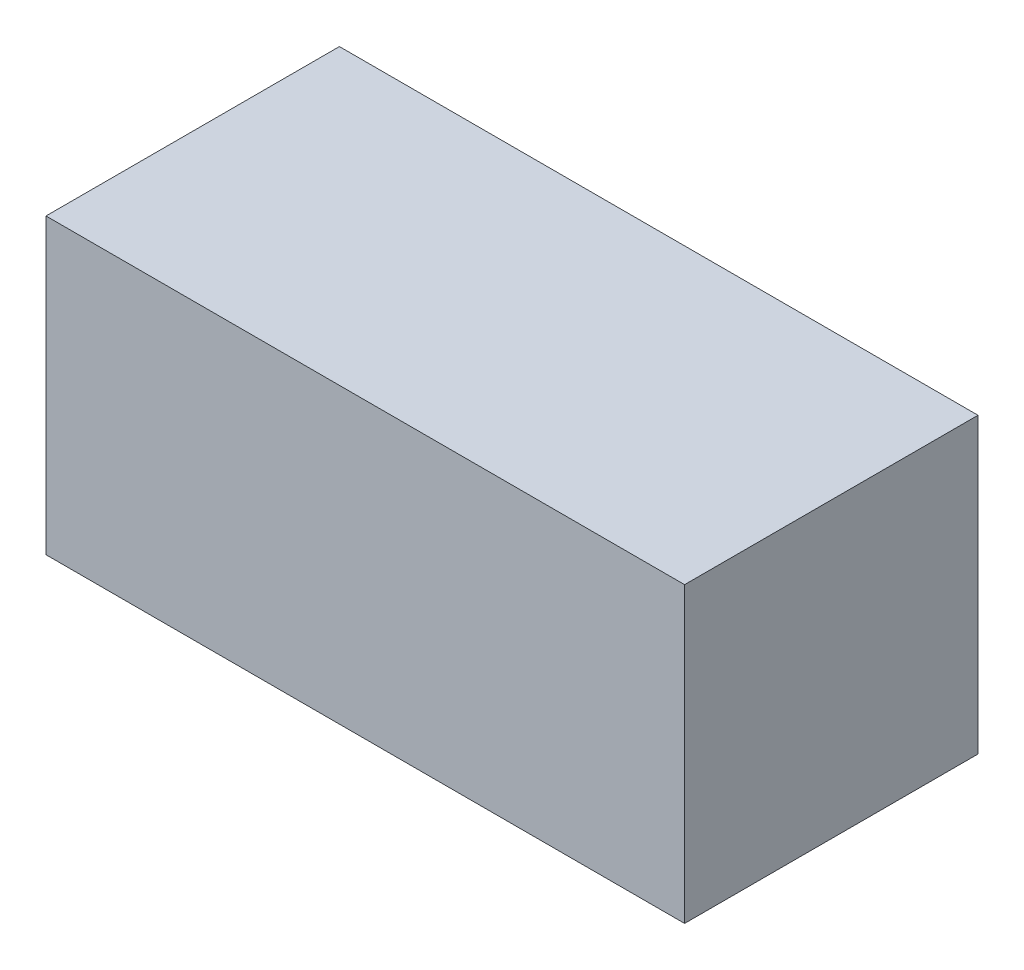
ISO-10303-21;
HEADER;
FILE_DESCRIPTION(('STEP AP214'),'2;1');
FILE_NAME('part.step','',(''),(''),'','','');
FILE_SCHEMA(('AUTOMOTIVE_DESIGN { 1 0 10303 214 1 1 1 1 }'));
ENDSEC;
DATA;
#1=APPLICATION_CONTEXT('core data for automotive mechanical design processes');
#2=APPLICATION_PROTOCOL_DEFINITION('international standard','automotive_design',2000,#1);
#3=PRODUCT_CONTEXT('',#1,'mechanical');
#4=PRODUCT('Part','Part','',(#3));
#5=PRODUCT_RELATED_PRODUCT_CATEGORY('part','',(#4));
#6=PRODUCT_DEFINITION_FORMATION('','',#4);
#7=PRODUCT_DEFINITION_CONTEXT('part definition',#1,'design');
#8=PRODUCT_DEFINITION('design','',#6,#7);
#9=PRODUCT_DEFINITION_SHAPE('','',#8);
#10=(LENGTH_UNIT() NAMED_UNIT(*) SI_UNIT(.MILLI.,.METRE.));
#11=(NAMED_UNIT(*) PLANE_ANGLE_UNIT() SI_UNIT($,.RADIAN.));
#12=(NAMED_UNIT(*) SI_UNIT($,.STERADIAN.) SOLID_ANGLE_UNIT());
#13=UNCERTAINTY_MEASURE_WITH_UNIT(LENGTH_MEASURE(1.E-05),#10,'distance_accuracy_value','');
#14=(GEOMETRIC_REPRESENTATION_CONTEXT(3) GLOBAL_UNCERTAINTY_ASSIGNED_CONTEXT((#13)) GLOBAL_UNIT_ASSIGNED_CONTEXT((#10,
#11,#12)) REPRESENTATION_CONTEXT('',''));
#15=CARTESIAN_POINT('',(0.,0.,0.));
#16=DIRECTION('',(0.,0.,1.));
#17=DIRECTION('',(1.,0.,0.));
#18=AXIS2_PLACEMENT_3D('',#15,#16,#17);
#19=CARTESIAN_POINT('',(1.850009,0.850010999999998,1.6999966));
#20=DIRECTION('',(-1.,0.,0.));
#21=DIRECTION('',(0.,0.,1.));
#22=AXIS2_PLACEMENT_3D('',#19,#20,#21);
#23=PLANE('',#22);
#24=DIRECTION('',(0.,1.,0.));
#25=VECTOR('',#24,1.);
#26=CARTESIAN_POINT('',(1.850009,0.850010999999998,0.));
#27=LINE('',#26,#25);
#28=CARTESIAN_POINT('',(1.850009,-0.850010999999998,0.));
#29=VERTEX_POINT('',#28);
#30=CARTESIAN_POINT('',(1.850009,0.850010999999998,0.));
#31=VERTEX_POINT('',#30);
#32=EDGE_CURVE('E95',#29,#31,#27,.T.);
#33=ORIENTED_EDGE('',*,*,#32,.T.);
#34=DIRECTION('',(0.,0.,-1.));
#35=VECTOR('',#34,1.);
#36=CARTESIAN_POINT('',(1.850009,0.850010999999998,1.6999966));
#37=LINE('',#36,#35);
#38=CARTESIAN_POINT('',(1.850009,0.850010999999998,1.6999966));
#39=VERTEX_POINT('',#38);
#40=EDGE_CURVE('E11',#39,#31,#37,.T.);
#41=ORIENTED_EDGE('',*,*,#40,.F.);
#42=DIRECTION('',(0.,1.,0.));
#43=VECTOR('',#42,1.);
#44=CARTESIAN_POINT('',(1.850009,0.850010999999998,1.6999966));
#45=LINE('',#44,#43);
#46=CARTESIAN_POINT('',(1.850009,-0.850010999999998,1.6999966));
#47=VERTEX_POINT('',#46);
#48=EDGE_CURVE('E83',#47,#39,#45,.T.);
#49=ORIENTED_EDGE('',*,*,#48,.F.);
#50=DIRECTION('',(0.,0.,-1.));
#51=VECTOR('',#50,1.);
#52=CARTESIAN_POINT('',(1.850009,-0.850010999999998,1.6999966));
#53=LINE('',#52,#51);
#54=EDGE_CURVE('E91',#47,#29,#53,.T.);
#55=ORIENTED_EDGE('',*,*,#54,.T.);
#56=EDGE_LOOP('',(#33,#41,#49,#55));
#57=FACE_BOUND('',#56,.T.);
#58=ADVANCED_FACE('F32',(#57),#23,.F.);
#59=CARTESIAN_POINT('',(-1.850009,0.850010999999998,1.6999966));
#60=DIRECTION('',(0.,-1.,0.));
#61=DIRECTION('',(0.,0.,-1.));
#62=AXIS2_PLACEMENT_3D('',#59,#60,#61);
#63=PLANE('',#62);
#64=DIRECTION('',(-1.,0.,0.));
#65=VECTOR('',#64,1.);
#66=CARTESIAN_POINT('',(-1.850009,0.850010999999998,0.));
#67=LINE('',#66,#65);
#68=CARTESIAN_POINT('',(-1.850009,0.850010999999998,0.));
#69=VERTEX_POINT('',#68);
#70=EDGE_CURVE('E87',#31,#69,#67,.T.);
#71=ORIENTED_EDGE('',*,*,#70,.T.);
#72=DIRECTION('',(0.,0.,-1.));
#73=VECTOR('',#72,1.);
#74=CARTESIAN_POINT('',(-1.850009,0.850010999999998,1.6999966));
#75=LINE('',#74,#73);
#76=CARTESIAN_POINT('',(-1.850009,0.850010999999998,1.6999966));
#77=VERTEX_POINT('',#76);
#78=EDGE_CURVE('E40',#77,#69,#75,.T.);
#79=ORIENTED_EDGE('',*,*,#78,.F.);
#80=DIRECTION('',(-1.,0.,0.));
#81=VECTOR('',#80,1.);
#82=CARTESIAN_POINT('',(-1.850009,0.850010999999998,1.6999966));
#83=LINE('',#82,#81);
#84=EDGE_CURVE('E78',#39,#77,#83,.T.);
#85=ORIENTED_EDGE('',*,*,#84,.F.);
#86=ORIENTED_EDGE('',*,*,#40,.T.);
#87=EDGE_LOOP('',(#71,#79,#85,#86));
#88=FACE_BOUND('',#87,.T.);
#89=ADVANCED_FACE('F86',(#88),#63,.F.);
#90=CARTESIAN_POINT('',(-1.850009,-0.850010999999998,1.6999966));
#91=DIRECTION('',(1.,0.,0.));
#92=DIRECTION('',(0.,0.,-1.));
#93=AXIS2_PLACEMENT_3D('',#90,#91,#92);
#94=PLANE('',#93);
#95=DIRECTION('',(0.,-1.,0.));
#96=VECTOR('',#95,1.);
#97=CARTESIAN_POINT('',(-1.850009,-0.850010999999998,0.));
#98=LINE('',#97,#96);
#99=CARTESIAN_POINT('',(-1.850009,-0.850010999999998,0.));
#100=VERTEX_POINT('',#99);
#101=EDGE_CURVE('E65',#69,#100,#98,.T.);
#102=ORIENTED_EDGE('',*,*,#101,.T.);
#103=DIRECTION('',(0.,0.,-1.));
#104=VECTOR('',#103,1.);
#105=CARTESIAN_POINT('',(-1.850009,-0.850010999999998,1.6999966));
#106=LINE('',#105,#104);
#107=CARTESIAN_POINT('',(-1.850009,-0.850010999999998,1.6999966));
#108=VERTEX_POINT('',#107);
#109=EDGE_CURVE('E88',#108,#100,#106,.T.);
#110=ORIENTED_EDGE('',*,*,#109,.F.);
#111=DIRECTION('',(0.,-1.,0.));
#112=VECTOR('',#111,1.);
#113=CARTESIAN_POINT('',(-1.850009,-0.850010999999998,1.6999966));
#114=LINE('',#113,#112);
#115=EDGE_CURVE('E81',#77,#108,#114,.T.);
#116=ORIENTED_EDGE('',*,*,#115,.F.);
#117=ORIENTED_EDGE('',*,*,#78,.T.);
#118=EDGE_LOOP('',(#102,#110,#116,#117));
#119=FACE_BOUND('',#118,.T.);
#120=ADVANCED_FACE('F89',(#119),#94,.F.);
#121=CARTESIAN_POINT('',(1.850009,-0.850010999999998,1.6999966));
#122=DIRECTION('',(0.,1.,0.));
#123=DIRECTION('',(0.,0.,1.));
#124=AXIS2_PLACEMENT_3D('',#121,#122,#123);
#125=PLANE('',#124);
#126=DIRECTION('',(1.,0.,0.));
#127=VECTOR('',#126,1.);
#128=CARTESIAN_POINT('',(1.850009,-0.850010999999998,0.));
#129=LINE('',#128,#127);
#130=EDGE_CURVE('E71',#100,#29,#129,.T.);
#131=ORIENTED_EDGE('',*,*,#130,.T.);
#132=ORIENTED_EDGE('',*,*,#54,.F.);
#133=DIRECTION('',(1.,0.,0.));
#134=VECTOR('',#133,1.);
#135=CARTESIAN_POINT('',(1.850009,-0.850010999999998,1.6999966));
#136=LINE('',#135,#134);
#137=EDGE_CURVE('E48',#108,#47,#136,.T.);
#138=ORIENTED_EDGE('',*,*,#137,.F.);
#139=ORIENTED_EDGE('',*,*,#109,.T.);
#140=EDGE_LOOP('',(#131,#132,#138,#139));
#141=FACE_BOUND('',#140,.T.);
#142=ADVANCED_FACE('F102',(#141),#125,.F.);
#143=CARTESIAN_POINT('',(0.,0.,1.6999966));
#144=DIRECTION('',(0.,0.,-1.));
#145=DIRECTION('',(-1.,0.,0.));
#146=AXIS2_PLACEMENT_3D('',#143,#144,#145);
#147=PLANE('',#146);
#148=ORIENTED_EDGE('',*,*,#48,.T.);
#149=ORIENTED_EDGE('',*,*,#84,.T.);
#150=ORIENTED_EDGE('',*,*,#115,.T.);
#151=ORIENTED_EDGE('',*,*,#137,.T.);
#152=EDGE_LOOP('',(#148,#149,#150,#151));
#153=FACE_BOUND('',#152,.T.);
#154=ADVANCED_FACE('F79',(#153),#147,.F.);
#155=CARTESIAN_POINT('',(0.,0.,0.));
#156=DIRECTION('',(0.,0.,-1.));
#157=DIRECTION('',(-1.,0.,0.));
#158=AXIS2_PLACEMENT_3D('',#155,#156,#157);
#159=PLANE('',#158);
#160=ORIENTED_EDGE('',*,*,#32,.F.);
#161=ORIENTED_EDGE('',*,*,#130,.F.);
#162=ORIENTED_EDGE('',*,*,#101,.F.);
#163=ORIENTED_EDGE('',*,*,#70,.F.);
#164=EDGE_LOOP('',(#160,#161,#162,#163));
#165=FACE_BOUND('',#164,.T.);
#166=ADVANCED_FACE('F105',(#165),#159,.T.);
#167=CLOSED_SHELL('',(#58,#89,#120,#142,#154,#166));
#168=MANIFOLD_SOLID_BREP('B2',#167);
#169=ADVANCED_BREP_SHAPE_REPRESENTATION('',(#18,#168),#14);
#170=SHAPE_DEFINITION_REPRESENTATION(#9,#169);
ENDSEC;
END-ISO-10303-21;
